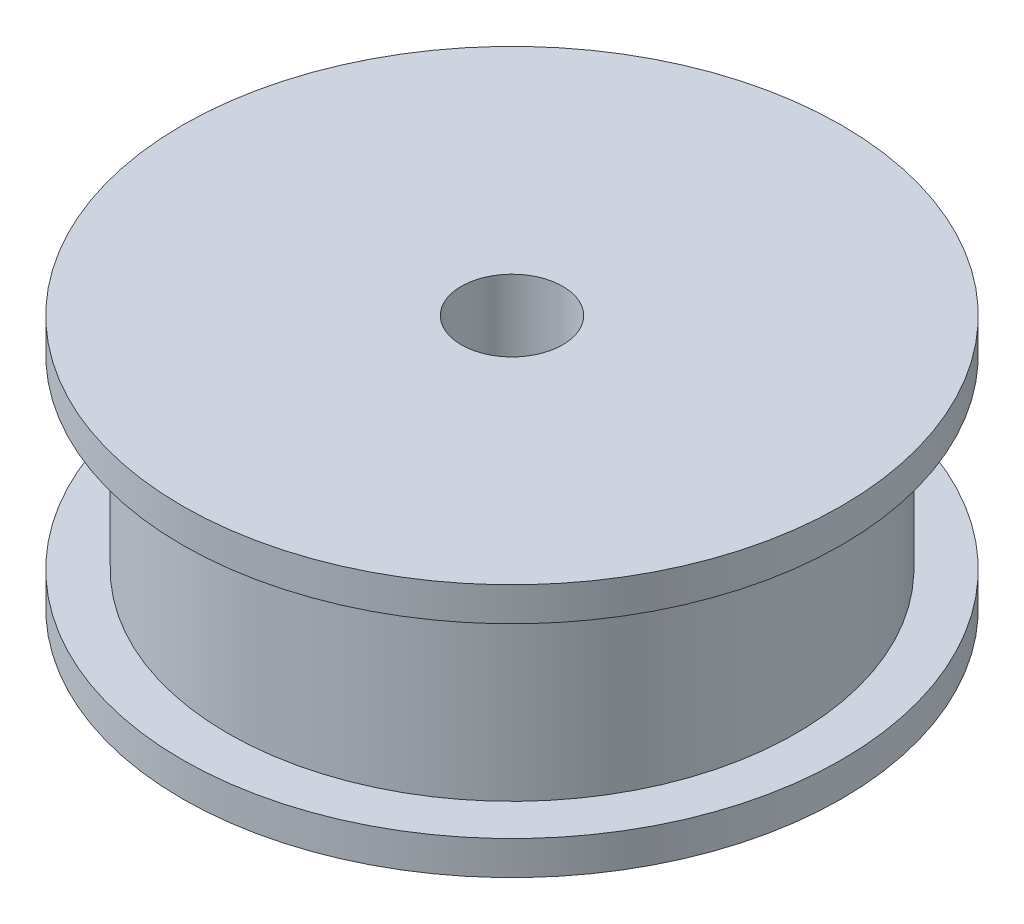
ISO-10303-21;
HEADER;
FILE_DESCRIPTION(('STEP AP214'),'2;1');
FILE_NAME('part.step','',(''),(''),'','','');
FILE_SCHEMA(('AUTOMOTIVE_DESIGN { 1 0 10303 214 1 1 1 1 }'));
ENDSEC;
DATA;
#1=APPLICATION_CONTEXT('core data for automotive mechanical design processes');
#2=APPLICATION_PROTOCOL_DEFINITION('international standard','automotive_design',2000,#1);
#3=PRODUCT_CONTEXT('',#1,'mechanical');
#4=PRODUCT('Part','Part','',(#3));
#5=PRODUCT_RELATED_PRODUCT_CATEGORY('part','',(#4));
#6=PRODUCT_DEFINITION_FORMATION('','',#4);
#7=PRODUCT_DEFINITION_CONTEXT('part definition',#1,'design');
#8=PRODUCT_DEFINITION('design','',#6,#7);
#9=PRODUCT_DEFINITION_SHAPE('','',#8);
#10=(LENGTH_UNIT() NAMED_UNIT(*) SI_UNIT(.MILLI.,.METRE.));
#11=(NAMED_UNIT(*) PLANE_ANGLE_UNIT() SI_UNIT($,.RADIAN.));
#12=(NAMED_UNIT(*) SI_UNIT($,.STERADIAN.) SOLID_ANGLE_UNIT());
#13=UNCERTAINTY_MEASURE_WITH_UNIT(LENGTH_MEASURE(1.E-05),#10,'distance_accuracy_value','');
#14=(GEOMETRIC_REPRESENTATION_CONTEXT(3) GLOBAL_UNCERTAINTY_ASSIGNED_CONTEXT((#13)) GLOBAL_UNIT_ASSIGNED_CONTEXT((#10,
#11,#12)) REPRESENTATION_CONTEXT('',''));
#15=CARTESIAN_POINT('',(0.,0.,0.));
#16=DIRECTION('',(0.,0.,1.));
#17=DIRECTION('',(1.,0.,0.));
#18=AXIS2_PLACEMENT_3D('',#15,#16,#17);
#19=CARTESIAN_POINT('',(0.,0.,0.));
#20=DIRECTION('',(0.,-1.,0.));
#21=DIRECTION('',(0.,0.,-1.));
#22=AXIS2_PLACEMENT_3D('',#19,#20,#21);
#23=PLANE('',#22);
#24=CARTESIAN_POINT('',(0.,0.,0.));
#25=DIRECTION('',(0.,1.,0.));
#26=DIRECTION('',(0.,0.,1.));
#27=AXIS2_PLACEMENT_3D('',#24,#25,#26);
#28=CIRCLE('',#27,3.);
#29=CARTESIAN_POINT('',(0.,0.,3.));
#30=VERTEX_POINT('',#29);
#31=EDGE_CURVE('E61',#30,#30,#28,.T.);
#32=ORIENTED_EDGE('',*,*,#31,.F.);
#33=EDGE_LOOP('',(#32));
#34=FACE_BOUND('',#33,.T.);
#35=CARTESIAN_POINT('',(0.,0.,0.));
#36=DIRECTION('',(0.,1.,0.));
#37=DIRECTION('',(0.,0.,1.));
#38=AXIS2_PLACEMENT_3D('',#35,#36,#37);
#39=CIRCLE('',#38,19.5);
#40=CARTESIAN_POINT('',(0.,0.,19.5));
#41=VERTEX_POINT('',#40);
#42=EDGE_CURVE('E10',#41,#41,#39,.T.);
#43=ORIENTED_EDGE('',*,*,#42,.T.);
#44=EDGE_LOOP('',(#43));
#45=FACE_BOUND('',#44,.T.);
#46=ADVANCED_FACE('F35',(#34,#45),#23,.F.);
#47=CARTESIAN_POINT('',(0.,23.5757575757576,0.));
#48=DIRECTION('',(0.,1.,0.));
#49=DIRECTION('',(0.,0.,1.));
#50=AXIS2_PLACEMENT_3D('',#47,#48,#49);
#51=CYLINDRICAL_SURFACE('',#50,19.5);
#52=ORIENTED_EDGE('',*,*,#42,.F.);
#53=EDGE_LOOP('',(#52));
#54=FACE_BOUND('',#53,.T.);
#55=CARTESIAN_POINT('',(0.,-2.,0.));
#56=DIRECTION('',(0.,1.,0.));
#57=DIRECTION('',(0.,0.,1.));
#58=AXIS2_PLACEMENT_3D('',#55,#56,#57);
#59=CIRCLE('',#58,19.5);
#60=CARTESIAN_POINT('',(0.,-2.,19.5));
#61=VERTEX_POINT('',#60);
#62=EDGE_CURVE('E41',#61,#61,#59,.T.);
#63=ORIENTED_EDGE('',*,*,#62,.T.);
#64=EDGE_LOOP('',(#63));
#65=FACE_BOUND('',#64,.T.);
#66=ADVANCED_FACE('F77',(#54,#65),#51,.T.);
#67=CARTESIAN_POINT('',(19.5,-2.,0.));
#68=DIRECTION('',(0.,1.,0.));
#69=DIRECTION('',(0.,0.,1.));
#70=AXIS2_PLACEMENT_3D('',#67,#68,#69);
#71=PLANE('',#70);
#72=ORIENTED_EDGE('',*,*,#62,.F.);
#73=EDGE_LOOP('',(#72));
#74=FACE_BOUND('',#73,.T.);
#75=CARTESIAN_POINT('',(0.,-2.,0.));
#76=DIRECTION('',(0.,1.,0.));
#77=DIRECTION('',(0.,0.,1.));
#78=AXIS2_PLACEMENT_3D('',#75,#76,#77);
#79=CIRCLE('',#78,16.805);
#80=CARTESIAN_POINT('',(0.,-2.,16.805));
#81=VERTEX_POINT('',#80);
#82=EDGE_CURVE('E45',#81,#81,#79,.T.);
#83=ORIENTED_EDGE('',*,*,#82,.T.);
#84=EDGE_LOOP('',(#83));
#85=FACE_BOUND('',#84,.T.);
#86=ADVANCED_FACE('F81',(#74,#85),#71,.F.);
#87=CARTESIAN_POINT('',(0.,23.5757575757576,0.));
#88=DIRECTION('',(0.,1.,0.));
#89=DIRECTION('',(0.,0.,1.));
#90=AXIS2_PLACEMENT_3D('',#87,#88,#89);
#91=CYLINDRICAL_SURFACE('',#90,16.805);
#92=ORIENTED_EDGE('',*,*,#82,.F.);
#93=EDGE_LOOP('',(#92));
#94=FACE_BOUND('',#93,.T.);
#95=CARTESIAN_POINT('',(0.,-13.,0.));
#96=DIRECTION('',(0.,1.,0.));
#97=DIRECTION('',(0.,0.,1.));
#98=AXIS2_PLACEMENT_3D('',#95,#96,#97);
#99=CIRCLE('',#98,16.805);
#100=CARTESIAN_POINT('',(0.,-13.,16.805));
#101=VERTEX_POINT('',#100);
#102=EDGE_CURVE('E49',#101,#101,#99,.T.);
#103=ORIENTED_EDGE('',*,*,#102,.T.);
#104=EDGE_LOOP('',(#103));
#105=FACE_BOUND('',#104,.T.);
#106=ADVANCED_FACE('F86',(#94,#105),#91,.T.);
#107=CARTESIAN_POINT('',(16.805,-13.,0.));
#108=DIRECTION('',(0.,-1.,0.));
#109=DIRECTION('',(0.,0.,-1.));
#110=AXIS2_PLACEMENT_3D('',#107,#108,#109);
#111=PLANE('',#110);
#112=ORIENTED_EDGE('',*,*,#102,.F.);
#113=EDGE_LOOP('',(#112));
#114=FACE_BOUND('',#113,.T.);
#115=CARTESIAN_POINT('',(0.,-13.,0.));
#116=DIRECTION('',(0.,1.,0.));
#117=DIRECTION('',(0.,0.,1.));
#118=AXIS2_PLACEMENT_3D('',#115,#116,#117);
#119=CIRCLE('',#118,19.5);
#120=CARTESIAN_POINT('',(0.,-13.,19.5));
#121=VERTEX_POINT('',#120);
#122=EDGE_CURVE('E54',#121,#121,#119,.T.);
#123=ORIENTED_EDGE('',*,*,#122,.T.);
#124=EDGE_LOOP('',(#123));
#125=FACE_BOUND('',#124,.T.);
#126=ADVANCED_FACE('F92',(#114,#125),#111,.F.);
#127=CARTESIAN_POINT('',(0.,23.5757575757576,0.));
#128=DIRECTION('',(0.,1.,0.));
#129=DIRECTION('',(0.,0.,1.));
#130=AXIS2_PLACEMENT_3D('',#127,#128,#129);
#131=CYLINDRICAL_SURFACE('',#130,19.5);
#132=ORIENTED_EDGE('',*,*,#122,.F.);
#133=EDGE_LOOP('',(#132));
#134=FACE_BOUND('',#133,.T.);
#135=CARTESIAN_POINT('',(0.,-15.,0.));
#136=DIRECTION('',(0.,1.,0.));
#137=DIRECTION('',(0.,0.,1.));
#138=AXIS2_PLACEMENT_3D('',#135,#136,#137);
#139=CIRCLE('',#138,19.5);
#140=CARTESIAN_POINT('',(0.,-15.,19.5));
#141=VERTEX_POINT('',#140);
#142=EDGE_CURVE('E57',#141,#141,#139,.T.);
#143=ORIENTED_EDGE('',*,*,#142,.T.);
#144=EDGE_LOOP('',(#143));
#145=FACE_BOUND('',#144,.T.);
#146=ADVANCED_FACE('F96',(#134,#145),#131,.T.);
#147=CARTESIAN_POINT('',(19.5,-15.,0.));
#148=DIRECTION('',(0.,1.,0.));
#149=DIRECTION('',(0.,0.,1.));
#150=AXIS2_PLACEMENT_3D('',#147,#148,#149);
#151=PLANE('',#150);
#152=CARTESIAN_POINT('',(0.,-15.,0.));
#153=DIRECTION('',(0.,1.,0.));
#154=DIRECTION('',(0.,0.,1.));
#155=AXIS2_PLACEMENT_3D('',#152,#153,#154);
#156=CIRCLE('',#155,3.);
#157=CARTESIAN_POINT('',(0.,-15.,3.));
#158=VERTEX_POINT('',#157);
#159=EDGE_CURVE('E60',#158,#158,#156,.T.);
#160=ORIENTED_EDGE('',*,*,#159,.T.);
#161=EDGE_LOOP('',(#160));
#162=FACE_BOUND('',#161,.T.);
#163=ORIENTED_EDGE('',*,*,#142,.F.);
#164=EDGE_LOOP('',(#163));
#165=FACE_BOUND('',#164,.T.);
#166=ADVANCED_FACE('F67',(#162,#165),#151,.F.);
#167=CARTESIAN_POINT('',(0.,-15.,0.));
#168=DIRECTION('',(0.,1.,0.));
#169=DIRECTION('',(0.,0.,1.));
#170=AXIS2_PLACEMENT_3D('',#167,#168,#169);
#171=CYLINDRICAL_SURFACE('',#170,3.);
#172=ORIENTED_EDGE('',*,*,#159,.F.);
#173=EDGE_LOOP('',(#172));
#174=FACE_BOUND('',#173,.T.);
#175=ORIENTED_EDGE('',*,*,#31,.T.);
#176=EDGE_LOOP('',(#175));
#177=FACE_BOUND('',#176,.T.);
#178=ADVANCED_FACE('F70',(#174,#177),#171,.F.);
#179=CLOSED_SHELL('',(#46,#66,#86,#106,#126,#146,#166,#178));
#180=MANIFOLD_SOLID_BREP('B2',#179);
#181=ADVANCED_BREP_SHAPE_REPRESENTATION('',(#18,#180),#14);
#182=SHAPE_DEFINITION_REPRESENTATION(#9,#181);
ENDSEC;
END-ISO-10303-21;
